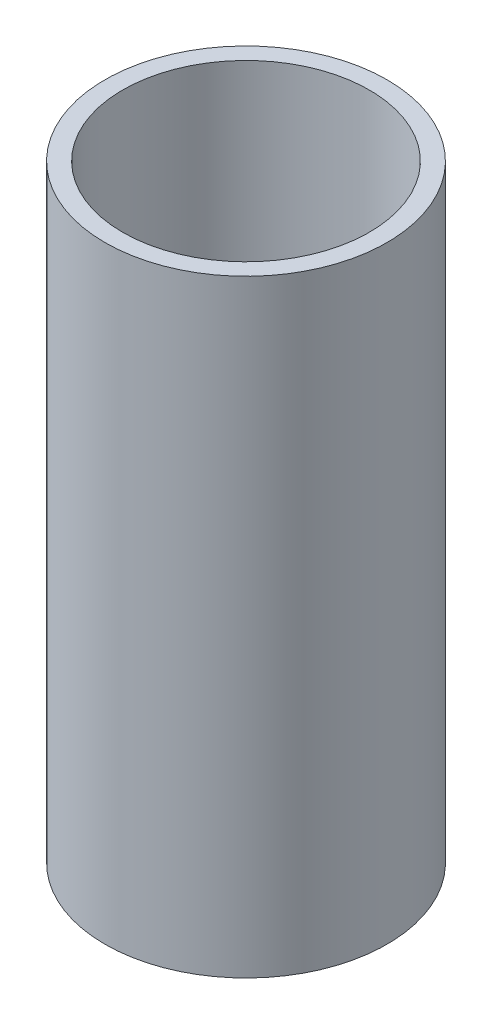
ISO-10303-21;
HEADER;
FILE_DESCRIPTION(('STEP AP214'),'2;1');
FILE_NAME('part.step','',(''),(''),'','','');
FILE_SCHEMA(('AUTOMOTIVE_DESIGN { 1 0 10303 214 1 1 1 1 }'));
ENDSEC;
DATA;
#1=APPLICATION_CONTEXT('core data for automotive mechanical design processes');
#2=APPLICATION_PROTOCOL_DEFINITION('international standard','automotive_design',2000,#1);
#3=PRODUCT_CONTEXT('',#1,'mechanical');
#4=PRODUCT('Part','Part','',(#3));
#5=PRODUCT_RELATED_PRODUCT_CATEGORY('part','',(#4));
#6=PRODUCT_DEFINITION_FORMATION('','',#4);
#7=PRODUCT_DEFINITION_CONTEXT('part definition',#1,'design');
#8=PRODUCT_DEFINITION('design','',#6,#7);
#9=PRODUCT_DEFINITION_SHAPE('','',#8);
#10=(LENGTH_UNIT() NAMED_UNIT(*) SI_UNIT(.MILLI.,.METRE.));
#11=(NAMED_UNIT(*) PLANE_ANGLE_UNIT() SI_UNIT($,.RADIAN.));
#12=(NAMED_UNIT(*) SI_UNIT($,.STERADIAN.) SOLID_ANGLE_UNIT());
#13=UNCERTAINTY_MEASURE_WITH_UNIT(LENGTH_MEASURE(1.E-05),#10,'distance_accuracy_value','');
#14=(GEOMETRIC_REPRESENTATION_CONTEXT(3) GLOBAL_UNCERTAINTY_ASSIGNED_CONTEXT((#13)) GLOBAL_UNIT_ASSIGNED_CONTEXT((#10,
#11,#12)) REPRESENTATION_CONTEXT('',''));
#15=CARTESIAN_POINT('',(0.,0.,0.));
#16=DIRECTION('',(0.,0.,1.));
#17=DIRECTION('',(1.,0.,0.));
#18=AXIS2_PLACEMENT_3D('',#15,#16,#17);
#19=CARTESIAN_POINT('',(0.,12.,0.));
#20=DIRECTION('',(0.,-1.,0.));
#21=DIRECTION('',(0.,0.,-1.));
#22=AXIS2_PLACEMENT_3D('',#19,#20,#21);
#23=CYLINDRICAL_SURFACE('',#22,2.785);
#24=CARTESIAN_POINT('',(0.,12.,0.));
#25=DIRECTION('',(0.,1.,0.));
#26=DIRECTION('',(0.,0.,1.));
#27=AXIS2_PLACEMENT_3D('',#24,#25,#26);
#28=CIRCLE('',#27,2.785);
#29=CARTESIAN_POINT('',(0.,12.,2.785));
#30=VERTEX_POINT('',#29);
#31=EDGE_CURVE('E10',#30,#30,#28,.T.);
#32=ORIENTED_EDGE('',*,*,#31,.F.);
#33=EDGE_LOOP('',(#32));
#34=FACE_BOUND('',#33,.T.);
#35=CARTESIAN_POINT('',(0.,0.,0.));
#36=DIRECTION('',(0.,1.,0.));
#37=DIRECTION('',(0.,0.,1.));
#38=AXIS2_PLACEMENT_3D('',#35,#36,#37);
#39=CIRCLE('',#38,2.785);
#40=CARTESIAN_POINT('',(0.,0.,2.785));
#41=VERTEX_POINT('',#40);
#42=EDGE_CURVE('E40',#41,#41,#39,.T.);
#43=ORIENTED_EDGE('',*,*,#42,.T.);
#44=EDGE_LOOP('',(#43));
#45=FACE_BOUND('',#44,.T.);
#46=ADVANCED_FACE('F37',(#34,#45),#23,.T.);
#47=CARTESIAN_POINT('',(0.,12.,0.));
#48=DIRECTION('',(0.,1.,0.));
#49=DIRECTION('',(0.,0.,1.));
#50=AXIS2_PLACEMENT_3D('',#47,#48,#49);
#51=PLANE('',#50);
#52=CARTESIAN_POINT('',(0.,12.,0.));
#53=DIRECTION('',(0.,1.,0.));
#54=DIRECTION('',(0.,0.,1.));
#55=AXIS2_PLACEMENT_3D('',#52,#53,#54);
#56=CIRCLE('',#55,2.435);
#57=CARTESIAN_POINT('',(0.,12.,2.435));
#58=VERTEX_POINT('',#57);
#59=EDGE_CURVE('E47',#58,#58,#56,.T.);
#60=ORIENTED_EDGE('',*,*,#59,.F.);
#61=EDGE_LOOP('',(#60));
#62=FACE_BOUND('',#61,.T.);
#63=ORIENTED_EDGE('',*,*,#31,.T.);
#64=EDGE_LOOP('',(#63));
#65=FACE_BOUND('',#64,.T.);
#66=ADVANCED_FACE('F58',(#62,#65),#51,.T.);
#67=CARTESIAN_POINT('',(0.,0.,0.));
#68=DIRECTION('',(0.,1.,0.));
#69=DIRECTION('',(0.,0.,1.));
#70=AXIS2_PLACEMENT_3D('',#67,#68,#69);
#71=PLANE('',#70);
#72=CARTESIAN_POINT('',(0.,0.,0.));
#73=DIRECTION('',(0.,1.,0.));
#74=DIRECTION('',(0.,0.,1.));
#75=AXIS2_PLACEMENT_3D('',#72,#73,#74);
#76=CIRCLE('',#75,2.435);
#77=CARTESIAN_POINT('',(0.,0.,2.435));
#78=VERTEX_POINT('',#77);
#79=EDGE_CURVE('E49',#78,#78,#76,.T.);
#80=ORIENTED_EDGE('',*,*,#79,.T.);
#81=EDGE_LOOP('',(#80));
#82=FACE_BOUND('',#81,.T.);
#83=ORIENTED_EDGE('',*,*,#42,.F.);
#84=EDGE_LOOP('',(#83));
#85=FACE_BOUND('',#84,.T.);
#86=ADVANCED_FACE('F60',(#82,#85),#71,.F.);
#87=CARTESIAN_POINT('',(0.,12.,0.));
#88=DIRECTION('',(0.,-1.,0.));
#89=DIRECTION('',(0.,0.,-1.));
#90=AXIS2_PLACEMENT_3D('',#87,#88,#89);
#91=CYLINDRICAL_SURFACE('',#90,2.435);
#92=ORIENTED_EDGE('',*,*,#59,.T.);
#93=EDGE_LOOP('',(#92));
#94=FACE_BOUND('',#93,.T.);
#95=ORIENTED_EDGE('',*,*,#79,.F.);
#96=EDGE_LOOP('',(#95));
#97=FACE_BOUND('',#96,.T.);
#98=ADVANCED_FACE('F55',(#94,#97),#91,.F.);
#99=CLOSED_SHELL('',(#46,#66,#86,#98));
#100=MANIFOLD_SOLID_BREP('B2',#99);
#101=ADVANCED_BREP_SHAPE_REPRESENTATION('',(#18,#100),#14);
#102=SHAPE_DEFINITION_REPRESENTATION(#9,#101);
ENDSEC;
END-ISO-10303-21;
